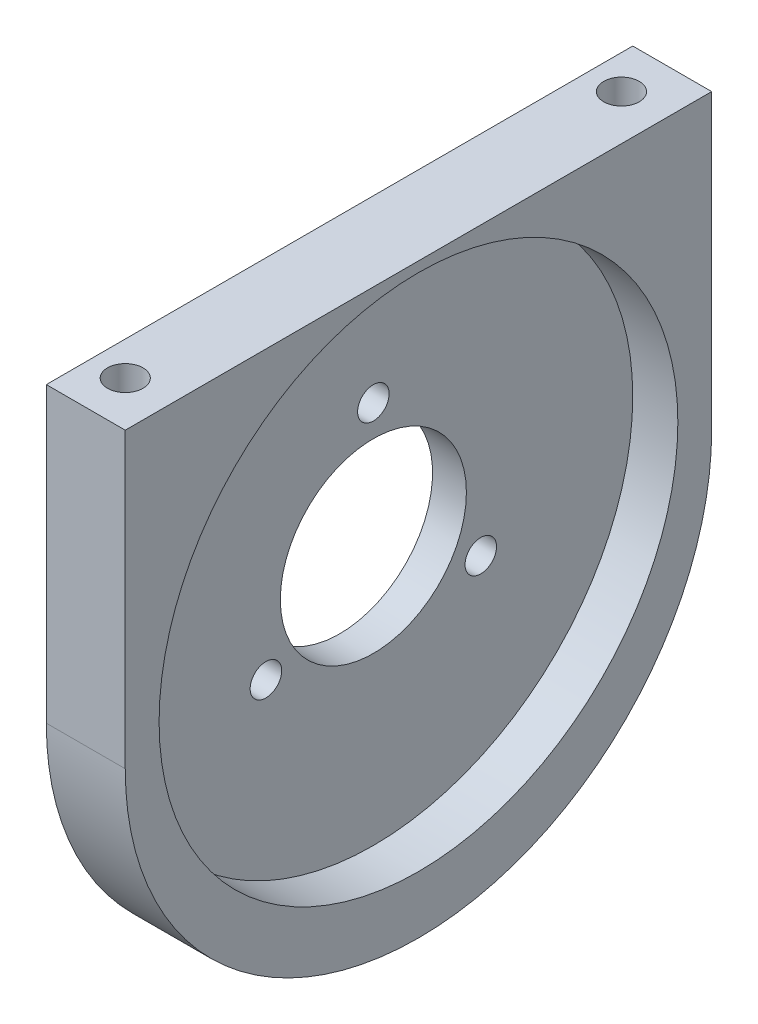
ISO-10303-21;
HEADER;
FILE_DESCRIPTION(('STEP AP214'),'2;1');
FILE_NAME('part.step','',(''),(''),'','','');
FILE_SCHEMA(('AUTOMOTIVE_DESIGN { 1 0 10303 214 1 1 1 1 }'));
ENDSEC;
DATA;
#1=APPLICATION_CONTEXT('core data for automotive mechanical design processes');
#2=APPLICATION_PROTOCOL_DEFINITION('international standard','automotive_design',2000,#1);
#3=PRODUCT_CONTEXT('',#1,'mechanical');
#4=PRODUCT('Part','Part','',(#3));
#5=PRODUCT_RELATED_PRODUCT_CATEGORY('part','',(#4));
#6=PRODUCT_DEFINITION_FORMATION('','',#4);
#7=PRODUCT_DEFINITION_CONTEXT('part definition',#1,'design');
#8=PRODUCT_DEFINITION('design','',#6,#7);
#9=PRODUCT_DEFINITION_SHAPE('','',#8);
#10=(LENGTH_UNIT() NAMED_UNIT(*) SI_UNIT(.MILLI.,.METRE.));
#11=(NAMED_UNIT(*) PLANE_ANGLE_UNIT() SI_UNIT($,.RADIAN.));
#12=(NAMED_UNIT(*) SI_UNIT($,.STERADIAN.) SOLID_ANGLE_UNIT());
#13=UNCERTAINTY_MEASURE_WITH_UNIT(LENGTH_MEASURE(1.E-05),#10,'distance_accuracy_value','');
#14=(GEOMETRIC_REPRESENTATION_CONTEXT(3) GLOBAL_UNCERTAINTY_ASSIGNED_CONTEXT((#13)) GLOBAL_UNIT_ASSIGNED_CONTEXT((#10,
#11,#12)) REPRESENTATION_CONTEXT('',''));
#15=CARTESIAN_POINT('',(0.,0.,0.));
#16=DIRECTION('',(0.,0.,1.));
#17=DIRECTION('',(1.,0.,0.));
#18=AXIS2_PLACEMENT_3D('',#15,#16,#17);
#19=CARTESIAN_POINT('',(7.,28.1,-26.));
#20=DIRECTION('',(-1.,0.,0.));
#21=DIRECTION('',(0.,0.,1.));
#22=AXIS2_PLACEMENT_3D('',#19,#20,#21);
#23=CYLINDRICAL_SURFACE('',#22,8.25);
#24=CARTESIAN_POINT('',(0.,28.1,-26.));
#25=DIRECTION('',(-1.,0.,0.));
#26=DIRECTION('',(0.,0.,1.));
#27=AXIS2_PLACEMENT_3D('',#24,#25,#26);
#28=CIRCLE('',#27,8.25);
#29=CARTESIAN_POINT('',(0.,28.1,-17.75));
#30=VERTEX_POINT('',#29);
#31=EDGE_CURVE('E148',#30,#30,#28,.T.);
#32=ORIENTED_EDGE('',*,*,#31,.T.);
#33=EDGE_LOOP('',(#32));
#34=FACE_BOUND('',#33,.T.);
#35=CARTESIAN_POINT('',(3.,28.1,-26.));
#36=DIRECTION('',(1.,0.,0.));
#37=DIRECTION('',(0.,0.,-1.));
#38=AXIS2_PLACEMENT_3D('',#35,#36,#37);
#39=CIRCLE('',#38,8.25);
#40=CARTESIAN_POINT('',(3.,28.1,-34.25));
#41=VERTEX_POINT('',#40);
#42=EDGE_CURVE('E127',#41,#41,#39,.F.);
#43=ORIENTED_EDGE('',*,*,#42,.F.);
#44=EDGE_LOOP('',(#43));
#45=FACE_BOUND('',#44,.T.);
#46=ADVANCED_FACE('F41',(#34,#45),#23,.F.);
#47=CARTESIAN_POINT('',(0.,39.1,-26.));
#48=DIRECTION('',(-1.,0.,0.));
#49=DIRECTION('',(0.,0.,1.));
#50=AXIS2_PLACEMENT_3D('',#47,#48,#49);
#51=CYLINDRICAL_SURFACE('',#50,1.39699999999999);
#52=CARTESIAN_POINT('',(0.948434313119681,39.1,-26.));
#53=DIRECTION('',(-1.,0.,0.));
#54=DIRECTION('',(0.,0.,1.));
#55=AXIS2_PLACEMENT_3D('',#52,#53,#54);
#56=CIRCLE('',#55,1.39699999999999);
#57=CARTESIAN_POINT('',(0.948434313119681,39.1,-24.603));
#58=VERTEX_POINT('',#57);
#59=EDGE_CURVE('E145',#58,#58,#56,.T.);
#60=ORIENTED_EDGE('',*,*,#59,.T.);
#61=EDGE_LOOP('',(#60));
#62=FACE_BOUND('',#61,.T.);
#63=CARTESIAN_POINT('',(3.,39.1,-26.));
#64=DIRECTION('',(1.,0.,0.));
#65=DIRECTION('',(0.,0.,-1.));
#66=AXIS2_PLACEMENT_3D('',#63,#64,#65);
#67=CIRCLE('',#66,1.39699999999999);
#68=CARTESIAN_POINT('',(3.,39.1,-27.397));
#69=VERTEX_POINT('',#68);
#70=EDGE_CURVE('E124',#69,#69,#67,.F.);
#71=ORIENTED_EDGE('',*,*,#70,.F.);
#72=EDGE_LOOP('',(#71));
#73=FACE_BOUND('',#72,.T.);
#74=ADVANCED_FACE('F208',(#62,#73),#51,.F.);
#75=CARTESIAN_POINT('',(0.,22.5999999999999,-35.5262794416288));
#76=DIRECTION('',(-1.,0.,0.));
#77=DIRECTION('',(0.,0.,1.));
#78=AXIS2_PLACEMENT_3D('',#75,#76,#77);
#79=CYLINDRICAL_SURFACE('',#78,1.39699999999999);
#80=CARTESIAN_POINT('',(0.948434313119681,22.5999999999999,-35.5262794416288));
#81=DIRECTION('',(-1.,0.,0.));
#82=DIRECTION('',(0.,0.,1.));
#83=AXIS2_PLACEMENT_3D('',#80,#81,#82);
#84=CIRCLE('',#83,1.39699999999999);
#85=CARTESIAN_POINT('',(0.948434313119681,22.5999999999999,-34.1292794416288));
#86=VERTEX_POINT('',#85);
#87=EDGE_CURVE('E139',#86,#86,#84,.T.);
#88=ORIENTED_EDGE('',*,*,#87,.T.);
#89=EDGE_LOOP('',(#88));
#90=FACE_BOUND('',#89,.T.);
#91=CARTESIAN_POINT('',(3.,22.5999999999999,-35.5262794416288));
#92=DIRECTION('',(1.,0.,0.));
#93=DIRECTION('',(0.,0.,-1.));
#94=AXIS2_PLACEMENT_3D('',#91,#92,#93);
#95=CIRCLE('',#94,1.39699999999999);
#96=CARTESIAN_POINT('',(3.,22.5999999999999,-36.9232794416288));
#97=VERTEX_POINT('',#96);
#98=EDGE_CURVE('E121',#97,#97,#95,.F.);
#99=ORIENTED_EDGE('',*,*,#98,.F.);
#100=EDGE_LOOP('',(#99));
#101=FACE_BOUND('',#100,.T.);
#102=ADVANCED_FACE('F214',(#90,#101),#79,.F.);
#103=CARTESIAN_POINT('',(0.,22.6000000000001,-16.4737205583711));
#104=DIRECTION('',(-1.,0.,0.));
#105=DIRECTION('',(0.,0.,1.));
#106=AXIS2_PLACEMENT_3D('',#103,#104,#105);
#107=CYLINDRICAL_SURFACE('',#106,1.39699999999999);
#108=CARTESIAN_POINT('',(0.948434313119681,22.6000000000001,-16.4737205583711));
#109=DIRECTION('',(-1.,0.,0.));
#110=DIRECTION('',(0.,0.,1.));
#111=AXIS2_PLACEMENT_3D('',#108,#109,#110);
#112=CIRCLE('',#111,1.39699999999999);
#113=CARTESIAN_POINT('',(0.948434313119681,22.6000000000001,-15.0767205583711));
#114=VERTEX_POINT('',#113);
#115=EDGE_CURVE('E133',#114,#114,#112,.T.);
#116=ORIENTED_EDGE('',*,*,#115,.T.);
#117=EDGE_LOOP('',(#116));
#118=FACE_BOUND('',#117,.T.);
#119=CARTESIAN_POINT('',(3.,22.6000000000001,-16.4737205583711));
#120=DIRECTION('',(1.,0.,0.));
#121=DIRECTION('',(0.,0.,-1.));
#122=AXIS2_PLACEMENT_3D('',#119,#120,#121);
#123=CIRCLE('',#122,1.39699999999999);
#124=CARTESIAN_POINT('',(3.,22.6000000000001,-17.8707205583711));
#125=VERTEX_POINT('',#124);
#126=EDGE_CURVE('E117',#125,#125,#123,.F.);
#127=ORIENTED_EDGE('',*,*,#126,.F.);
#128=EDGE_LOOP('',(#127));
#129=FACE_BOUND('',#128,.T.);
#130=ADVANCED_FACE('F235',(#118,#129),#107,.F.);
#131=CARTESIAN_POINT('',(7.,0.,0.));
#132=DIRECTION('',(0.,0.,-1.));
#133=DIRECTION('',(-1.,0.,0.));
#134=AXIS2_PLACEMENT_3D('',#131,#132,#133);
#135=PLANE('',#134);
#136=DIRECTION('',(0.,-1.,0.));
#137=VECTOR('',#136,1.);
#138=CARTESIAN_POINT('',(0.,0.,0.));
#139=LINE('',#138,#137);
#140=CARTESIAN_POINT('',(0.,52.,0.));
#141=VERTEX_POINT('',#140);
#142=CARTESIAN_POINT('',(0.,26.,0.));
#143=VERTEX_POINT('',#142);
#144=EDGE_CURVE('E151',#141,#143,#139,.T.);
#145=ORIENTED_EDGE('',*,*,#144,.T.);
#146=DIRECTION('',(-1.,0.,0.));
#147=VECTOR('',#146,1.);
#148=CARTESIAN_POINT('',(7.,26.,0.));
#149=LINE('',#148,#147);
#150=CARTESIAN_POINT('',(7.,26.,0.));
#151=VERTEX_POINT('',#150);
#152=EDGE_CURVE('E11',#143,#151,#149,.F.);
#153=ORIENTED_EDGE('',*,*,#152,.T.);
#154=DIRECTION('',(0.,-1.,0.));
#155=VECTOR('',#154,1.);
#156=CARTESIAN_POINT('',(7.,0.,0.));
#157=LINE('',#156,#155);
#158=CARTESIAN_POINT('',(7.,52.,0.));
#159=VERTEX_POINT('',#158);
#160=EDGE_CURVE('E152',#159,#151,#157,.T.);
#161=ORIENTED_EDGE('',*,*,#160,.F.);
#162=DIRECTION('',(-1.,0.,0.));
#163=VECTOR('',#162,1.);
#164=CARTESIAN_POINT('',(7.,52.,0.));
#165=LINE('',#164,#163);
#166=EDGE_CURVE('E159',#159,#141,#165,.T.);
#167=ORIENTED_EDGE('',*,*,#166,.T.);
#168=EDGE_LOOP('',(#145,#153,#161,#167));
#169=FACE_BOUND('',#168,.T.);
#170=ADVANCED_FACE('F233',(#169),#135,.F.);
#171=CARTESIAN_POINT('',(7.,0.,-52.));
#172=DIRECTION('',(0.,0.,1.));
#173=DIRECTION('',(1.,0.,0.));
#174=AXIS2_PLACEMENT_3D('',#171,#172,#173);
#175=PLANE('',#174);
#176=DIRECTION('',(0.,1.,0.));
#177=VECTOR('',#176,1.);
#178=CARTESIAN_POINT('',(7.,0.,-52.));
#179=LINE('',#178,#177);
#180=CARTESIAN_POINT('',(7.,26.,-52.));
#181=VERTEX_POINT('',#180);
#182=CARTESIAN_POINT('',(7.,52.,-52.));
#183=VERTEX_POINT('',#182);
#184=EDGE_CURVE('E154',#181,#183,#179,.T.);
#185=ORIENTED_EDGE('',*,*,#184,.F.);
#186=DIRECTION('',(-1.,0.,0.));
#187=VECTOR('',#186,1.);
#188=CARTESIAN_POINT('',(7.,26.,-52.));
#189=LINE('',#188,#187);
#190=CARTESIAN_POINT('',(0.,26.,-52.));
#191=VERTEX_POINT('',#190);
#192=EDGE_CURVE('E169',#181,#191,#189,.T.);
#193=ORIENTED_EDGE('',*,*,#192,.T.);
#194=DIRECTION('',(0.,1.,0.));
#195=VECTOR('',#194,1.);
#196=CARTESIAN_POINT('',(0.,0.,-52.));
#197=LINE('',#196,#195);
#198=CARTESIAN_POINT('',(0.,52.,-52.));
#199=VERTEX_POINT('',#198);
#200=EDGE_CURVE('E161',#191,#199,#197,.T.);
#201=ORIENTED_EDGE('',*,*,#200,.T.);
#202=DIRECTION('',(-1.,0.,0.));
#203=VECTOR('',#202,1.);
#204=CARTESIAN_POINT('',(7.,52.,-52.));
#205=LINE('',#204,#203);
#206=EDGE_CURVE('E166',#183,#199,#205,.T.);
#207=ORIENTED_EDGE('',*,*,#206,.F.);
#208=EDGE_LOOP('',(#185,#193,#201,#207));
#209=FACE_BOUND('',#208,.T.);
#210=ADVANCED_FACE('F187',(#209),#175,.F.);
#211=CARTESIAN_POINT('',(7.,52.,0.));
#212=DIRECTION('',(0.,-1.,0.));
#213=DIRECTION('',(0.,0.,-1.));
#214=AXIS2_PLACEMENT_3D('',#211,#212,#213);
#215=PLANE('',#214);
#216=CARTESIAN_POINT('',(3.,52.,-48.));
#217=DIRECTION('',(0.,1.,0.));
#218=DIRECTION('',(0.,0.,1.));
#219=AXIS2_PLACEMENT_3D('',#216,#217,#218);
#220=CIRCLE('',#219,1.57499999999999);
#221=CARTESIAN_POINT('',(3.,52.,-46.425));
#222=VERTEX_POINT('',#221);
#223=EDGE_CURVE('E104',#222,#222,#220,.T.);
#224=ORIENTED_EDGE('',*,*,#223,.F.);
#225=EDGE_LOOP('',(#224));
#226=FACE_BOUND('',#225,.T.);
#227=CARTESIAN_POINT('',(3.,52.,-4.));
#228=DIRECTION('',(0.,1.,0.));
#229=DIRECTION('',(0.,0.,1.));
#230=AXIS2_PLACEMENT_3D('',#227,#228,#229);
#231=CIRCLE('',#230,1.57499999999999);
#232=CARTESIAN_POINT('',(3.,52.,-2.42500000000001));
#233=VERTEX_POINT('',#232);
#234=EDGE_CURVE('E103',#233,#233,#231,.T.);
#235=ORIENTED_EDGE('',*,*,#234,.F.);
#236=EDGE_LOOP('',(#235));
#237=FACE_BOUND('',#236,.T.);
#238=DIRECTION('',(0.,0.,1.));
#239=VECTOR('',#238,1.);
#240=CARTESIAN_POINT('',(0.,52.,0.));
#241=LINE('',#240,#239);
#242=EDGE_CURVE('E155',#199,#141,#241,.T.);
#243=ORIENTED_EDGE('',*,*,#242,.T.);
#244=ORIENTED_EDGE('',*,*,#166,.F.);
#245=DIRECTION('',(0.,0.,1.));
#246=VECTOR('',#245,1.);
#247=CARTESIAN_POINT('',(7.,52.,0.));
#248=LINE('',#247,#246);
#249=EDGE_CURVE('E157',#183,#159,#248,.T.);
#250=ORIENTED_EDGE('',*,*,#249,.F.);
#251=ORIENTED_EDGE('',*,*,#206,.T.);
#252=EDGE_LOOP('',(#243,#244,#250,#251));
#253=FACE_BOUND('',#252,.T.);
#254=ADVANCED_FACE('F222',(#226,#237,#253),#215,.F.);
#255=CARTESIAN_POINT('',(7.,0.,0.));
#256=DIRECTION('',(-1.,0.,0.));
#257=DIRECTION('',(0.,0.,1.));
#258=AXIS2_PLACEMENT_3D('',#255,#256,#257);
#259=PLANE('',#258);
#260=CARTESIAN_POINT('',(7.,28.1,-26.));
#261=DIRECTION('',(1.,0.,0.));
#262=DIRECTION('',(0.,0.,-1.));
#263=AXIS2_PLACEMENT_3D('',#260,#261,#262);
#264=CIRCLE('',#263,23.);
#265=CARTESIAN_POINT('',(7.,28.1,-49.));
#266=VERTEX_POINT('',#265);
#267=EDGE_CURVE('E118',#266,#266,#264,.T.);
#268=ORIENTED_EDGE('',*,*,#267,.F.);
#269=EDGE_LOOP('',(#268));
#270=FACE_BOUND('',#269,.T.);
#271=CARTESIAN_POINT('',(7.,26.,-26.));
#272=DIRECTION('',(-1.,0.,0.));
#273=DIRECTION('',(0.,0.,1.));
#274=AXIS2_PLACEMENT_3D('',#271,#272,#273);
#275=CIRCLE('',#274,26.);
#276=CARTESIAN_POINT('',(7.,0.,-26.));
#277=VERTEX_POINT('',#276);
#278=EDGE_CURVE('E57',#151,#277,#275,.F.);
#279=ORIENTED_EDGE('',*,*,#278,.T.);
#280=CARTESIAN_POINT('',(7.,26.,-26.));
#281=DIRECTION('',(-1.,0.,0.));
#282=DIRECTION('',(0.,0.,1.));
#283=AXIS2_PLACEMENT_3D('',#280,#281,#282);
#284=CIRCLE('',#283,26.);
#285=EDGE_CURVE('E50',#277,#181,#284,.F.);
#286=ORIENTED_EDGE('',*,*,#285,.T.);
#287=ORIENTED_EDGE('',*,*,#184,.T.);
#288=ORIENTED_EDGE('',*,*,#249,.T.);
#289=ORIENTED_EDGE('',*,*,#160,.T.);
#290=EDGE_LOOP('',(#279,#286,#287,#288,#289));
#291=FACE_BOUND('',#290,.T.);
#292=ADVANCED_FACE('F181',(#270,#291),#259,.F.);
#293=CARTESIAN_POINT('',(0.,0.,0.));
#294=DIRECTION('',(-1.,0.,0.));
#295=DIRECTION('',(0.,0.,1.));
#296=AXIS2_PLACEMENT_3D('',#293,#294,#295);
#297=PLANE('',#296);
#298=CARTESIAN_POINT('',(0.,22.6000000000001,-16.4737205583711));
#299=DIRECTION('',(-1.,0.,0.));
#300=DIRECTION('',(0.,0.,1.));
#301=AXIS2_PLACEMENT_3D('',#298,#299,#300);
#302=CIRCLE('',#301,2.5273);
#303=CARTESIAN_POINT('',(0.,22.6000000000001,-13.9464205583711));
#304=VERTEX_POINT('',#303);
#305=EDGE_CURVE('E130',#304,#304,#302,.T.);
#306=ORIENTED_EDGE('',*,*,#305,.F.);
#307=EDGE_LOOP('',(#306));
#308=FACE_BOUND('',#307,.T.);
#309=CARTESIAN_POINT('',(0.,22.5999999999999,-35.5262794416288));
#310=DIRECTION('',(-1.,0.,0.));
#311=DIRECTION('',(0.,0.,1.));
#312=AXIS2_PLACEMENT_3D('',#309,#310,#311);
#313=CIRCLE('',#312,2.5273);
#314=CARTESIAN_POINT('',(0.,22.5999999999999,-32.9989794416288));
#315=VERTEX_POINT('',#314);
#316=EDGE_CURVE('E136',#315,#315,#313,.T.);
#317=ORIENTED_EDGE('',*,*,#316,.F.);
#318=EDGE_LOOP('',(#317));
#319=FACE_BOUND('',#318,.T.);
#320=CARTESIAN_POINT('',(0.,39.1,-26.));
#321=DIRECTION('',(-1.,0.,0.));
#322=DIRECTION('',(0.,0.,1.));
#323=AXIS2_PLACEMENT_3D('',#320,#321,#322);
#324=CIRCLE('',#323,2.5273);
#325=CARTESIAN_POINT('',(0.,39.1,-23.4727));
#326=VERTEX_POINT('',#325);
#327=EDGE_CURVE('E142',#326,#326,#324,.T.);
#328=ORIENTED_EDGE('',*,*,#327,.F.);
#329=EDGE_LOOP('',(#328));
#330=FACE_BOUND('',#329,.T.);
#331=ORIENTED_EDGE('',*,*,#31,.F.);
#332=EDGE_LOOP('',(#331));
#333=FACE_BOUND('',#332,.T.);
#334=ORIENTED_EDGE('',*,*,#200,.F.);
#335=CARTESIAN_POINT('',(0.,26.,-26.));
#336=DIRECTION('',(-1.,0.,0.));
#337=DIRECTION('',(0.,0.,1.));
#338=AXIS2_PLACEMENT_3D('',#335,#336,#337);
#339=CIRCLE('',#338,26.);
#340=CARTESIAN_POINT('',(0.,0.,-26.));
#341=VERTEX_POINT('',#340);
#342=EDGE_CURVE('E176',#191,#341,#339,.T.);
#343=ORIENTED_EDGE('',*,*,#342,.T.);
#344=CARTESIAN_POINT('',(0.,26.,-26.));
#345=DIRECTION('',(-1.,0.,0.));
#346=DIRECTION('',(0.,0.,1.));
#347=AXIS2_PLACEMENT_3D('',#344,#345,#346);
#348=CIRCLE('',#347,26.);
#349=EDGE_CURVE('E174',#341,#143,#348,.T.);
#350=ORIENTED_EDGE('',*,*,#349,.T.);
#351=ORIENTED_EDGE('',*,*,#144,.F.);
#352=ORIENTED_EDGE('',*,*,#242,.F.);
#353=EDGE_LOOP('',(#334,#343,#350,#351,#352));
#354=FACE_BOUND('',#353,.T.);
#355=ADVANCED_FACE('F193',(#308,#319,#330,#333,#354),#297,.T.);
#356=CARTESIAN_POINT('',(0.,39.1,-26.));
#357=DIRECTION('',(-1.,0.,0.));
#358=DIRECTION('',(0.,0.,1.));
#359=AXIS2_PLACEMENT_3D('',#356,#357,#358);
#360=CONICAL_SURFACE('',#359,2.5273,0.872664625997166);
#361=ORIENTED_EDGE('',*,*,#59,.F.);
#362=EDGE_LOOP('',(#361));
#363=FACE_BOUND('',#362,.T.);
#364=ORIENTED_EDGE('',*,*,#327,.T.);
#365=EDGE_LOOP('',(#364));
#366=FACE_BOUND('',#365,.T.);
#367=ADVANCED_FACE('F226',(#363,#366),#360,.F.);
#368=CARTESIAN_POINT('',(0.,22.5999999999999,-35.5262794416288));
#369=DIRECTION('',(-1.,0.,0.));
#370=DIRECTION('',(0.,0.,1.));
#371=AXIS2_PLACEMENT_3D('',#368,#369,#370);
#372=CONICAL_SURFACE('',#371,2.5273,0.872664625997168);
#373=ORIENTED_EDGE('',*,*,#87,.F.);
#374=EDGE_LOOP('',(#373));
#375=FACE_BOUND('',#374,.T.);
#376=ORIENTED_EDGE('',*,*,#316,.T.);
#377=EDGE_LOOP('',(#376));
#378=FACE_BOUND('',#377,.T.);
#379=ADVANCED_FACE('F252',(#375,#378),#372,.F.);
#380=CARTESIAN_POINT('',(0.,22.6000000000001,-16.4737205583711));
#381=DIRECTION('',(-1.,0.,0.));
#382=DIRECTION('',(0.,0.,1.));
#383=AXIS2_PLACEMENT_3D('',#380,#381,#382);
#384=CONICAL_SURFACE('',#383,2.5273,0.872664625997168);
#385=ORIENTED_EDGE('',*,*,#115,.F.);
#386=EDGE_LOOP('',(#385));
#387=FACE_BOUND('',#386,.T.);
#388=ORIENTED_EDGE('',*,*,#305,.T.);
#389=EDGE_LOOP('',(#388));
#390=FACE_BOUND('',#389,.T.);
#391=ADVANCED_FACE('F251',(#387,#390),#384,.F.);
#392=CARTESIAN_POINT('',(3.,28.1,-26.));
#393=DIRECTION('',(1.,0.,0.));
#394=DIRECTION('',(0.,0.,-1.));
#395=AXIS2_PLACEMENT_3D('',#392,#393,#394);
#396=PLANE('',#395);
#397=CARTESIAN_POINT('',(3.,28.1,-26.));
#398=DIRECTION('',(1.,0.,0.));
#399=DIRECTION('',(0.,0.,-1.));
#400=AXIS2_PLACEMENT_3D('',#397,#398,#399);
#401=CIRCLE('',#400,23.);
#402=CARTESIAN_POINT('',(3.,28.1,-49.));
#403=VERTEX_POINT('',#402);
#404=EDGE_CURVE('E114',#403,#403,#401,.T.);
#405=ORIENTED_EDGE('',*,*,#404,.T.);
#406=EDGE_LOOP('',(#405));
#407=FACE_BOUND('',#406,.T.);
#408=ORIENTED_EDGE('',*,*,#126,.T.);
#409=EDGE_LOOP('',(#408));
#410=FACE_BOUND('',#409,.T.);
#411=ORIENTED_EDGE('',*,*,#98,.T.);
#412=EDGE_LOOP('',(#411));
#413=FACE_BOUND('',#412,.T.);
#414=ORIENTED_EDGE('',*,*,#70,.T.);
#415=EDGE_LOOP('',(#414));
#416=FACE_BOUND('',#415,.T.);
#417=ORIENTED_EDGE('',*,*,#42,.T.);
#418=EDGE_LOOP('',(#417));
#419=FACE_BOUND('',#418,.T.);
#420=ADVANCED_FACE('F204',(#407,#410,#413,#416,#419),#396,.T.);
#421=CARTESIAN_POINT('',(3.,28.1,-26.));
#422=DIRECTION('',(1.,0.,0.));
#423=DIRECTION('',(0.,0.,-1.));
#424=AXIS2_PLACEMENT_3D('',#421,#422,#423);
#425=CYLINDRICAL_SURFACE('',#424,23.);
#426=ORIENTED_EDGE('',*,*,#404,.F.);
#427=EDGE_LOOP('',(#426));
#428=FACE_BOUND('',#427,.T.);
#429=ORIENTED_EDGE('',*,*,#267,.T.);
#430=EDGE_LOOP('',(#429));
#431=FACE_BOUND('',#430,.T.);
#432=ADVANCED_FACE('F198',(#428,#431),#425,.F.);
#433=CARTESIAN_POINT('',(7.,26.,-26.));
#434=DIRECTION('',(-1.,0.,0.));
#435=DIRECTION('',(0.,0.,1.));
#436=AXIS2_PLACEMENT_3D('',#433,#434,#435);
#437=CYLINDRICAL_SURFACE('',#436,26.);
#438=DIRECTION('',(-1.,0.,0.));
#439=VECTOR('',#438,1.);
#440=CARTESIAN_POINT('',(7.,0.,-26.));
#441=LINE('',#440,#439);
#442=EDGE_CURVE('E45',#277,#341,#441,.T.);
#443=ORIENTED_EDGE('',*,*,#442,.F.);
#444=ORIENTED_EDGE('',*,*,#278,.F.);
#445=ORIENTED_EDGE('',*,*,#152,.F.);
#446=ORIENTED_EDGE('',*,*,#349,.F.);
#447=EDGE_LOOP('',(#443,#444,#445,#446));
#448=FACE_BOUND('',#447,.T.);
#449=ADVANCED_FACE('F43',(#448),#437,.T.);
#450=CARTESIAN_POINT('',(7.,26.,-26.));
#451=DIRECTION('',(-1.,0.,0.));
#452=DIRECTION('',(0.,0.,1.));
#453=AXIS2_PLACEMENT_3D('',#450,#451,#452);
#454=CYLINDRICAL_SURFACE('',#453,26.);
#455=ORIENTED_EDGE('',*,*,#285,.F.);
#456=ORIENTED_EDGE('',*,*,#442,.T.);
#457=ORIENTED_EDGE('',*,*,#342,.F.);
#458=ORIENTED_EDGE('',*,*,#192,.F.);
#459=EDGE_LOOP('',(#455,#456,#457,#458));
#460=FACE_BOUND('',#459,.T.);
#461=ADVANCED_FACE('F190',(#460),#454,.T.);
#462=CARTESIAN_POINT('',(3.,42.,-4.));
#463=DIRECTION('',(0.,1.,0.));
#464=DIRECTION('',(0.,0.,1.));
#465=AXIS2_PLACEMENT_3D('',#462,#463,#464);
#466=CONICAL_SURFACE('',#465,1.575,1.02974425867665);
#467=CARTESIAN_POINT('',(3.,41.0536445250316,-4.));
#468=VERTEX_POINT('',#467);
#469=VERTEX_LOOP('',#468);
#470=FACE_BOUND('',#469,.T.);
#471=CARTESIAN_POINT('',(3.,42.,-4.));
#472=DIRECTION('',(0.,1.,0.));
#473=DIRECTION('',(0.,0.,1.));
#474=AXIS2_PLACEMENT_3D('',#471,#472,#473);
#475=CIRCLE('',#474,1.575);
#476=CARTESIAN_POINT('',(3.,42.,-2.425));
#477=VERTEX_POINT('',#476);
#478=EDGE_CURVE('E107',#477,#477,#475,.T.);
#479=ORIENTED_EDGE('',*,*,#478,.T.);
#480=EDGE_LOOP('',(#479));
#481=FACE_BOUND('',#480,.T.);
#482=ADVANCED_FACE('F203',(#470,#481),#466,.F.);
#483=CARTESIAN_POINT('',(3.,52.,-4.));
#484=DIRECTION('',(0.,1.,0.));
#485=DIRECTION('',(0.,0.,1.));
#486=AXIS2_PLACEMENT_3D('',#483,#484,#485);
#487=CYLINDRICAL_SURFACE('',#486,1.57499999999999);
#488=ORIENTED_EDGE('',*,*,#478,.F.);
#489=EDGE_LOOP('',(#488));
#490=FACE_BOUND('',#489,.T.);
#491=ORIENTED_EDGE('',*,*,#234,.T.);
#492=EDGE_LOOP('',(#491));
#493=FACE_BOUND('',#492,.T.);
#494=ADVANCED_FACE('F97',(#490,#493),#487,.F.);
#495=CARTESIAN_POINT('',(3.,42.,-48.));
#496=DIRECTION('',(0.,1.,0.));
#497=DIRECTION('',(0.,0.,1.));
#498=AXIS2_PLACEMENT_3D('',#495,#496,#497);
#499=CONICAL_SURFACE('',#498,1.575,1.02974425867665);
#500=CARTESIAN_POINT('',(3.,41.0536445250316,-48.));
#501=VERTEX_POINT('',#500);
#502=VERTEX_LOOP('',#501);
#503=FACE_BOUND('',#502,.T.);
#504=CARTESIAN_POINT('',(3.,42.,-48.));
#505=DIRECTION('',(0.,1.,0.));
#506=DIRECTION('',(0.,0.,1.));
#507=AXIS2_PLACEMENT_3D('',#504,#505,#506);
#508=CIRCLE('',#507,1.575);
#509=CARTESIAN_POINT('',(3.,42.,-46.425));
#510=VERTEX_POINT('',#509);
#511=EDGE_CURVE('E101',#510,#510,#508,.T.);
#512=ORIENTED_EDGE('',*,*,#511,.T.);
#513=EDGE_LOOP('',(#512));
#514=FACE_BOUND('',#513,.T.);
#515=ADVANCED_FACE('F93',(#503,#514),#499,.F.);
#516=CARTESIAN_POINT('',(3.,52.,-48.));
#517=DIRECTION('',(0.,1.,0.));
#518=DIRECTION('',(0.,0.,1.));
#519=AXIS2_PLACEMENT_3D('',#516,#517,#518);
#520=CYLINDRICAL_SURFACE('',#519,1.57499999999999);
#521=ORIENTED_EDGE('',*,*,#511,.F.);
#522=EDGE_LOOP('',(#521));
#523=FACE_BOUND('',#522,.T.);
#524=ORIENTED_EDGE('',*,*,#223,.T.);
#525=EDGE_LOOP('',(#524));
#526=FACE_BOUND('',#525,.T.);
#527=ADVANCED_FACE('F96',(#523,#526),#520,.F.);
#528=CLOSED_SHELL('',(#46,#74,#102,#130,#170,#210,#254,#292,#355,#367,#379,#391,#420,#432,#449,
#461,#482,#494,#515,#527));
#529=MANIFOLD_SOLID_BREP('B2',#528);
#530=ADVANCED_BREP_SHAPE_REPRESENTATION('',(#18,#529),#14);
#531=SHAPE_DEFINITION_REPRESENTATION(#9,#530);
ENDSEC;
END-ISO-10303-21;
